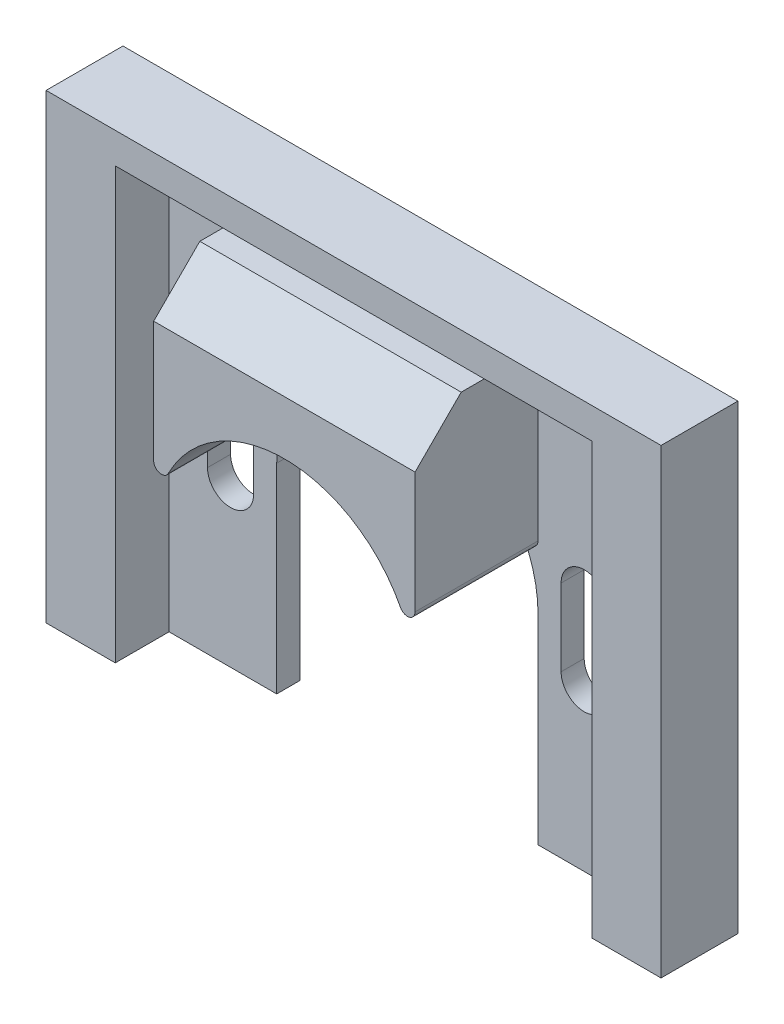
ISO-10303-21;
HEADER;
FILE_DESCRIPTION(('STEP AP214'),'2;1');
FILE_NAME('part.step','',(''),(''),'','','');
FILE_SCHEMA(('AUTOMOTIVE_DESIGN { 1 0 10303 214 1 1 1 1 }'));
ENDSEC;
DATA;
#1=APPLICATION_CONTEXT('core data for automotive mechanical design processes');
#2=APPLICATION_PROTOCOL_DEFINITION('international standard','automotive_design',2000,#1);
#3=PRODUCT_CONTEXT('',#1,'mechanical');
#4=PRODUCT('Part','Part','',(#3));
#5=PRODUCT_RELATED_PRODUCT_CATEGORY('part','',(#4));
#6=PRODUCT_DEFINITION_FORMATION('','',#4);
#7=PRODUCT_DEFINITION_CONTEXT('part definition',#1,'design');
#8=PRODUCT_DEFINITION('design','',#6,#7);
#9=PRODUCT_DEFINITION_SHAPE('','',#8);
#10=(LENGTH_UNIT() NAMED_UNIT(*) SI_UNIT(.MILLI.,.METRE.));
#11=(NAMED_UNIT(*) PLANE_ANGLE_UNIT() SI_UNIT($,.RADIAN.));
#12=(NAMED_UNIT(*) SI_UNIT($,.STERADIAN.) SOLID_ANGLE_UNIT());
#13=UNCERTAINTY_MEASURE_WITH_UNIT(LENGTH_MEASURE(1.E-05),#10,'distance_accuracy_value','');
#14=(GEOMETRIC_REPRESENTATION_CONTEXT(3) GLOBAL_UNCERTAINTY_ASSIGNED_CONTEXT((#13)) GLOBAL_UNIT_ASSIGNED_CONTEXT((#10,
#11,#12)) REPRESENTATION_CONTEXT('',''));
#15=CARTESIAN_POINT('',(0.,0.,0.));
#16=DIRECTION('',(0.,0.,1.));
#17=DIRECTION('',(1.,0.,0.));
#18=AXIS2_PLACEMENT_3D('',#15,#16,#17);
#19=CARTESIAN_POINT('',(-15.5,13.,1.5));
#20=DIRECTION('',(0.,1.,0.));
#21=DIRECTION('',(0.,0.,1.));
#22=AXIS2_PLACEMENT_3D('',#19,#20,#21);
#23=PLANE('',#22);
#24=DIRECTION('',(0.,0.,-1.));
#25=VECTOR('',#24,1.);
#26=CARTESIAN_POINT('',(8.5,13.,9.5));
#27=LINE('',#26,#25);
#28=CARTESIAN_POINT('',(8.5,13.,5.));
#29=VERTEX_POINT('',#28);
#30=CARTESIAN_POINT('',(8.5,13.,1.5));
#31=VERTEX_POINT('',#30);
#32=EDGE_CURVE('E229',#29,#31,#27,.T.);
#33=ORIENTED_EDGE('',*,*,#32,.T.);
#34=DIRECTION('',(-1.,0.,0.));
#35=VECTOR('',#34,1.);
#36=CARTESIAN_POINT('',(-15.5,13.,1.5));
#37=LINE('',#36,#35);
#38=CARTESIAN_POINT('',(15.5,13.,1.5));
#39=VERTEX_POINT('',#38);
#40=EDGE_CURVE('E241',#39,#31,#37,.T.);
#41=ORIENTED_EDGE('',*,*,#40,.F.);
#42=DIRECTION('',(0.,0.,1.));
#43=VECTOR('',#42,1.);
#44=CARTESIAN_POINT('',(15.5,13.,1.5));
#45=LINE('',#44,#43);
#46=CARTESIAN_POINT('',(15.5,13.,5.));
#47=VERTEX_POINT('',#46);
#48=EDGE_CURVE('E273',#39,#47,#45,.T.);
#49=ORIENTED_EDGE('',*,*,#48,.T.);
#50=DIRECTION('',(-1.,0.,0.));
#51=VECTOR('',#50,1.);
#52=CARTESIAN_POINT('',(-15.5,13.,5.));
#53=LINE('',#52,#51);
#54=EDGE_CURVE('E243',#47,#29,#53,.T.);
#55=ORIENTED_EDGE('',*,*,#54,.T.);
#56=EDGE_LOOP('',(#33,#41,#49,#55));
#57=FACE_BOUND('',#56,.T.);
#58=ADVANCED_FACE('F41',(#57),#23,.F.);
#59=DIRECTION('',(0.,0.,-1.));
#60=VECTOR('',#59,1.);
#61=CARTESIAN_POINT('',(-8.5,13.,9.5));
#62=LINE('',#61,#60);
#63=CARTESIAN_POINT('',(-8.5,13.,5.));
#64=VERTEX_POINT('',#63);
#65=CARTESIAN_POINT('',(-8.5,13.,1.5));
#66=VERTEX_POINT('',#65);
#67=EDGE_CURVE('E346',#64,#66,#62,.T.);
#68=ORIENTED_EDGE('',*,*,#67,.F.);
#69=CARTESIAN_POINT('',(-15.5,13.,5.));
#70=VERTEX_POINT('',#69);
#71=EDGE_CURVE('E266',#64,#70,#53,.T.);
#72=ORIENTED_EDGE('',*,*,#71,.T.);
#73=DIRECTION('',(0.,0.,1.));
#74=VECTOR('',#73,1.);
#75=CARTESIAN_POINT('',(-15.5,13.,1.5));
#76=LINE('',#75,#74);
#77=CARTESIAN_POINT('',(-15.5,13.,1.5));
#78=VERTEX_POINT('',#77);
#79=EDGE_CURVE('E269',#78,#70,#76,.T.);
#80=ORIENTED_EDGE('',*,*,#79,.F.);
#81=EDGE_CURVE('E252',#66,#78,#37,.T.);
#82=ORIENTED_EDGE('',*,*,#81,.F.);
#83=EDGE_LOOP('',(#68,#72,#80,#82));
#84=FACE_BOUND('',#83,.T.);
#85=ADVANCED_FACE('F473',(#84),#23,.F.);
#86=CARTESIAN_POINT('',(0.,0.,1.5));
#87=DIRECTION('',(0.,0.,-1.));
#88=DIRECTION('',(-1.,0.,0.));
#89=AXIS2_PLACEMENT_3D('',#86,#87,#88);
#90=PLANE('',#89);
#91=DIRECTION('',(0.,1.,0.));
#92=VECTOR('',#91,1.);
#93=CARTESIAN_POINT('',(13.,-4.5,1.5));
#94=LINE('',#93,#92);
#95=CARTESIAN_POINT('',(13.,-4.5,1.5));
#96=VERTEX_POINT('',#95);
#97=CARTESIAN_POINT('',(13.,0.500000000000004,1.5));
#98=VERTEX_POINT('',#97);
#99=EDGE_CURVE('E376',#96,#98,#94,.T.);
#100=ORIENTED_EDGE('',*,*,#99,.F.);
#101=CARTESIAN_POINT('',(11.5,-4.5,1.5));
#102=DIRECTION('',(0.,0.,1.));
#103=DIRECTION('',(1.,0.,0.));
#104=AXIS2_PLACEMENT_3D('',#101,#102,#103);
#105=CIRCLE('',#104,1.5);
#106=CARTESIAN_POINT('',(10.,-4.5,1.5));
#107=VERTEX_POINT('',#106);
#108=EDGE_CURVE('E379',#107,#96,#105,.T.);
#109=ORIENTED_EDGE('',*,*,#108,.F.);
#110=DIRECTION('',(0.,-1.,0.));
#111=VECTOR('',#110,1.);
#112=CARTESIAN_POINT('',(10.,-4.5,1.5));
#113=LINE('',#112,#111);
#114=CARTESIAN_POINT('',(10.,0.500000000000004,1.5));
#115=VERTEX_POINT('',#114);
#116=EDGE_CURVE('E369',#115,#107,#113,.T.);
#117=ORIENTED_EDGE('',*,*,#116,.F.);
#118=CARTESIAN_POINT('',(11.5,0.500000000000004,1.5));
#119=DIRECTION('',(0.,0.,1.));
#120=DIRECTION('',(-1.,0.,0.));
#121=AXIS2_PLACEMENT_3D('',#118,#119,#120);
#122=CIRCLE('',#121,1.5);
#123=EDGE_CURVE('E372',#98,#115,#122,.T.);
#124=ORIENTED_EDGE('',*,*,#123,.F.);
#125=EDGE_LOOP('',(#100,#109,#117,#124));
#126=FACE_BOUND('',#125,.T.);
#127=DIRECTION('',(0.,1.,0.));
#128=VECTOR('',#127,1.);
#129=CARTESIAN_POINT('',(8.5,13.,1.5));
#130=LINE('',#129,#128);
#131=CARTESIAN_POINT('',(8.5,2.12310562561767,1.5));
#132=VERTEX_POINT('',#131);
#133=EDGE_CURVE('E226',#132,#31,#130,.T.);
#134=ORIENTED_EDGE('',*,*,#133,.F.);
#135=CARTESIAN_POINT('',(8.,2.12310562561767,1.5));
#136=DIRECTION('',(0.,0.,-1.));
#137=DIRECTION('',(-1.,0.,0.));
#138=AXIS2_PLACEMENT_3D('',#135,#136,#137);
#139=CIRCLE('',#138,0.5);
#140=CARTESIAN_POINT('',(7.55555555555556,1.89404420197224,1.5));
#141=VERTEX_POINT('',#140);
#142=EDGE_CURVE('E329',#132,#141,#139,.T.);
#143=ORIENTED_EDGE('',*,*,#142,.T.);
#144=CARTESIAN_POINT('',(0.,-2.,1.5));
#145=DIRECTION('',(0.,0.,-1.));
#146=DIRECTION('',(-1.,0.,0.));
#147=AXIS2_PLACEMENT_3D('',#144,#145,#146);
#148=CIRCLE('',#147,8.5);
#149=CARTESIAN_POINT('',(8.5,-2.,1.5));
#150=VERTEX_POINT('',#149);
#151=EDGE_CURVE('E311',#150,#141,#148,.F.);
#152=ORIENTED_EDGE('',*,*,#151,.F.);
#153=DIRECTION('',(0.,1.,0.));
#154=VECTOR('',#153,1.);
#155=CARTESIAN_POINT('',(8.5,-2.,1.5));
#156=LINE('',#155,#154);
#157=CARTESIAN_POINT('',(8.5,-15.,1.5));
#158=VERTEX_POINT('',#157);
#159=EDGE_CURVE('E426',#158,#150,#156,.T.);
#160=ORIENTED_EDGE('',*,*,#159,.F.);
#161=DIRECTION('',(1.,0.,0.));
#162=VECTOR('',#161,1.);
#163=CARTESIAN_POINT('',(-15.5,-15.,1.5));
#164=LINE('',#163,#162);
#165=CARTESIAN_POINT('',(15.5,-15.,1.5));
#166=VERTEX_POINT('',#165);
#167=EDGE_CURVE('E446',#158,#166,#164,.T.);
#168=ORIENTED_EDGE('',*,*,#167,.T.);
#169=DIRECTION('',(0.,1.,0.));
#170=VECTOR('',#169,1.);
#171=CARTESIAN_POINT('',(15.5,-15.,1.5));
#172=LINE('',#171,#170);
#173=EDGE_CURVE('E250',#166,#39,#172,.T.);
#174=ORIENTED_EDGE('',*,*,#173,.T.);
#175=ORIENTED_EDGE('',*,*,#40,.T.);
#176=EDGE_LOOP('',(#134,#143,#152,#160,#168,#174,#175));
#177=FACE_BOUND('',#176,.T.);
#178=ADVANCED_FACE('F248',(#126,#177),#90,.F.);
#179=DIRECTION('',(0.,1.,0.));
#180=VECTOR('',#179,1.);
#181=CARTESIAN_POINT('',(-10.,-4.5,1.5));
#182=LINE('',#181,#180);
#183=CARTESIAN_POINT('',(-10.,-4.5,1.5));
#184=VERTEX_POINT('',#183);
#185=CARTESIAN_POINT('',(-10.,0.500000000000004,1.5));
#186=VERTEX_POINT('',#185);
#187=EDGE_CURVE('E408',#184,#186,#182,.T.);
#188=ORIENTED_EDGE('',*,*,#187,.F.);
#189=CARTESIAN_POINT('',(-11.5,-4.5,1.5));
#190=DIRECTION('',(0.,0.,1.));
#191=DIRECTION('',(-1.,0.,0.));
#192=AXIS2_PLACEMENT_3D('',#189,#190,#191);
#193=CIRCLE('',#192,1.5);
#194=CARTESIAN_POINT('',(-13.,-4.5,1.5));
#195=VERTEX_POINT('',#194);
#196=EDGE_CURVE('E368',#195,#184,#193,.T.);
#197=ORIENTED_EDGE('',*,*,#196,.F.);
#198=DIRECTION('',(0.,-1.,0.));
#199=VECTOR('',#198,1.);
#200=CARTESIAN_POINT('',(-13.,-4.5,1.5));
#201=LINE('',#200,#199);
#202=CARTESIAN_POINT('',(-13.,0.500000000000004,1.5));
#203=VERTEX_POINT('',#202);
#204=EDGE_CURVE('E401',#203,#195,#201,.T.);
#205=ORIENTED_EDGE('',*,*,#204,.F.);
#206=CARTESIAN_POINT('',(-11.5,0.500000000000004,1.5));
#207=DIRECTION('',(0.,0.,1.));
#208=DIRECTION('',(1.,0.,0.));
#209=AXIS2_PLACEMENT_3D('',#206,#207,#208);
#210=CIRCLE('',#209,1.5);
#211=EDGE_CURVE('E404',#186,#203,#210,.T.);
#212=ORIENTED_EDGE('',*,*,#211,.F.);
#213=EDGE_LOOP('',(#188,#197,#205,#212));
#214=FACE_BOUND('',#213,.T.);
#215=DIRECTION('',(0.,-1.,0.));
#216=VECTOR('',#215,1.);
#217=CARTESIAN_POINT('',(-8.5,-2.00000000000006,1.5));
#218=LINE('',#217,#216);
#219=CARTESIAN_POINT('',(-8.5,2.12310562561767,1.5));
#220=VERTEX_POINT('',#219);
#221=EDGE_CURVE('E236',#66,#220,#218,.T.);
#222=ORIENTED_EDGE('',*,*,#221,.F.);
#223=ORIENTED_EDGE('',*,*,#81,.T.);
#224=DIRECTION('',(0.,-1.,0.));
#225=VECTOR('',#224,1.);
#226=CARTESIAN_POINT('',(-15.5,-15.,1.5));
#227=LINE('',#226,#225);
#228=CARTESIAN_POINT('',(-15.5,-15.,1.5));
#229=VERTEX_POINT('',#228);
#230=EDGE_CURVE('E268',#78,#229,#227,.T.);
#231=ORIENTED_EDGE('',*,*,#230,.T.);
#232=CARTESIAN_POINT('',(-8.5,-15.,1.5));
#233=VERTEX_POINT('',#232);
#234=EDGE_CURVE('E447',#229,#233,#164,.T.);
#235=ORIENTED_EDGE('',*,*,#234,.T.);
#236=DIRECTION('',(0.,-1.,0.));
#237=VECTOR('',#236,1.);
#238=CARTESIAN_POINT('',(-8.5,-15.,1.5));
#239=LINE('',#238,#237);
#240=CARTESIAN_POINT('',(-8.5,-2.,1.5));
#241=VERTEX_POINT('',#240);
#242=EDGE_CURVE('E381',#241,#233,#239,.T.);
#243=ORIENTED_EDGE('',*,*,#242,.F.);
#244=CARTESIAN_POINT('',(0.,-2.,1.5));
#245=DIRECTION('',(0.,0.,-1.));
#246=DIRECTION('',(-1.,0.,0.));
#247=AXIS2_PLACEMENT_3D('',#244,#245,#246);
#248=CIRCLE('',#247,8.5);
#249=CARTESIAN_POINT('',(-7.55555555555556,1.89404420197224,1.5));
#250=VERTEX_POINT('',#249);
#251=EDGE_CURVE('E314',#250,#241,#248,.F.);
#252=ORIENTED_EDGE('',*,*,#251,.F.);
#253=CARTESIAN_POINT('',(-8.,2.12310562561767,1.5));
#254=DIRECTION('',(0.,0.,-1.));
#255=DIRECTION('',(-1.,0.,0.));
#256=AXIS2_PLACEMENT_3D('',#253,#254,#255);
#257=CIRCLE('',#256,0.5);
#258=EDGE_CURVE('E327',#250,#220,#257,.T.);
#259=ORIENTED_EDGE('',*,*,#258,.T.);
#260=EDGE_LOOP('',(#222,#223,#231,#235,#243,#252,#259));
#261=FACE_BOUND('',#260,.T.);
#262=ADVANCED_FACE('F476',(#214,#261),#90,.F.);
#263=CARTESIAN_POINT('',(-20.,-15.,5.));
#264=DIRECTION('',(0.,1.,0.));
#265=DIRECTION('',(0.,0.,1.));
#266=AXIS2_PLACEMENT_3D('',#263,#264,#265);
#267=PLANE('',#266);
#268=ORIENTED_EDGE('',*,*,#167,.F.);
#269=DIRECTION('',(0.,0.,1.));
#270=VECTOR('',#269,1.);
#271=CARTESIAN_POINT('',(8.5,-15.,0.));
#272=LINE('',#271,#270);
#273=CARTESIAN_POINT('',(8.5,-15.,0.));
#274=VERTEX_POINT('',#273);
#275=EDGE_CURVE('E438',#274,#158,#272,.T.);
#276=ORIENTED_EDGE('',*,*,#275,.F.);
#277=DIRECTION('',(1.,0.,0.));
#278=VECTOR('',#277,1.);
#279=CARTESIAN_POINT('',(-20.,-15.,0.));
#280=LINE('',#279,#278);
#281=CARTESIAN_POINT('',(20.,-15.,0.));
#282=VERTEX_POINT('',#281);
#283=EDGE_CURVE('E295',#274,#282,#280,.T.);
#284=ORIENTED_EDGE('',*,*,#283,.T.);
#285=DIRECTION('',(0.,0.,-1.));
#286=VECTOR('',#285,1.);
#287=CARTESIAN_POINT('',(20.,-15.,5.));
#288=LINE('',#287,#286);
#289=CARTESIAN_POINT('',(20.,-15.,5.));
#290=VERTEX_POINT('',#289);
#291=EDGE_CURVE('E288',#290,#282,#288,.T.);
#292=ORIENTED_EDGE('',*,*,#291,.F.);
#293=DIRECTION('',(1.,0.,0.));
#294=VECTOR('',#293,1.);
#295=CARTESIAN_POINT('',(-20.,-15.,5.));
#296=LINE('',#295,#294);
#297=CARTESIAN_POINT('',(15.5,-15.,5.));
#298=VERTEX_POINT('',#297);
#299=EDGE_CURVE('E284',#298,#290,#296,.T.);
#300=ORIENTED_EDGE('',*,*,#299,.F.);
#301=DIRECTION('',(0.,0.,1.));
#302=VECTOR('',#301,1.);
#303=CARTESIAN_POINT('',(15.5,-15.,1.5));
#304=LINE('',#303,#302);
#305=EDGE_CURVE('E255',#166,#298,#304,.T.);
#306=ORIENTED_EDGE('',*,*,#305,.F.);
#307=EDGE_LOOP('',(#268,#276,#284,#292,#300,#306));
#308=FACE_BOUND('',#307,.T.);
#309=ADVANCED_FACE('F461',(#308),#267,.F.);
#310=CARTESIAN_POINT('',(20.,-15.,5.));
#311=DIRECTION('',(-1.,0.,0.));
#312=DIRECTION('',(0.,0.,1.));
#313=AXIS2_PLACEMENT_3D('',#310,#311,#312);
#314=PLANE('',#313);
#315=DIRECTION('',(0.,1.,0.));
#316=VECTOR('',#315,1.);
#317=CARTESIAN_POINT('',(20.,-15.,0.));
#318=LINE('',#317,#316);
#319=CARTESIAN_POINT('',(20.,15.,0.));
#320=VERTEX_POINT('',#319);
#321=EDGE_CURVE('E272',#282,#320,#318,.T.);
#322=ORIENTED_EDGE('',*,*,#321,.T.);
#323=DIRECTION('',(0.,0.,-1.));
#324=VECTOR('',#323,1.);
#325=CARTESIAN_POINT('',(20.,15.,5.));
#326=LINE('',#325,#324);
#327=CARTESIAN_POINT('',(20.,15.,5.));
#328=VERTEX_POINT('',#327);
#329=EDGE_CURVE('E306',#328,#320,#326,.T.);
#330=ORIENTED_EDGE('',*,*,#329,.F.);
#331=DIRECTION('',(0.,1.,0.));
#332=VECTOR('',#331,1.);
#333=CARTESIAN_POINT('',(20.,-15.,5.));
#334=LINE('',#333,#332);
#335=EDGE_CURVE('E276',#290,#328,#334,.T.);
#336=ORIENTED_EDGE('',*,*,#335,.F.);
#337=ORIENTED_EDGE('',*,*,#291,.T.);
#338=EDGE_LOOP('',(#322,#330,#336,#337));
#339=FACE_BOUND('',#338,.T.);
#340=ADVANCED_FACE('F525',(#339),#314,.F.);
#341=CARTESIAN_POINT('',(-20.,15.,5.));
#342=DIRECTION('',(0.,-1.,0.));
#343=DIRECTION('',(0.,0.,-1.));
#344=AXIS2_PLACEMENT_3D('',#341,#342,#343);
#345=PLANE('',#344);
#346=DIRECTION('',(-1.,0.,0.));
#347=VECTOR('',#346,1.);
#348=CARTESIAN_POINT('',(-20.,15.,0.));
#349=LINE('',#348,#347);
#350=CARTESIAN_POINT('',(-20.,15.,0.));
#351=VERTEX_POINT('',#350);
#352=EDGE_CURVE('E291',#320,#351,#349,.T.);
#353=ORIENTED_EDGE('',*,*,#352,.T.);
#354=DIRECTION('',(0.,0.,-1.));
#355=VECTOR('',#354,1.);
#356=CARTESIAN_POINT('',(-20.,15.,5.));
#357=LINE('',#356,#355);
#358=CARTESIAN_POINT('',(-20.,15.,5.));
#359=VERTEX_POINT('',#358);
#360=EDGE_CURVE('E303',#359,#351,#357,.T.);
#361=ORIENTED_EDGE('',*,*,#360,.F.);
#362=DIRECTION('',(-1.,0.,0.));
#363=VECTOR('',#362,1.);
#364=CARTESIAN_POINT('',(-20.,15.,5.));
#365=LINE('',#364,#363);
#366=EDGE_CURVE('E279',#328,#359,#365,.T.);
#367=ORIENTED_EDGE('',*,*,#366,.F.);
#368=ORIENTED_EDGE('',*,*,#329,.T.);
#369=EDGE_LOOP('',(#353,#361,#367,#368));
#370=FACE_BOUND('',#369,.T.);
#371=ADVANCED_FACE('F521',(#370),#345,.F.);
#372=CARTESIAN_POINT('',(-20.,-15.,5.));
#373=DIRECTION('',(1.,0.,0.));
#374=DIRECTION('',(0.,0.,-1.));
#375=AXIS2_PLACEMENT_3D('',#372,#373,#374);
#376=PLANE('',#375);
#377=DIRECTION('',(0.,-1.,0.));
#378=VECTOR('',#377,1.);
#379=CARTESIAN_POINT('',(-20.,-15.,0.));
#380=LINE('',#379,#378);
#381=CARTESIAN_POINT('',(-20.,-15.,0.));
#382=VERTEX_POINT('',#381);
#383=EDGE_CURVE('E293',#351,#382,#380,.T.);
#384=ORIENTED_EDGE('',*,*,#383,.T.);
#385=DIRECTION('',(0.,0.,-1.));
#386=VECTOR('',#385,1.);
#387=CARTESIAN_POINT('',(-20.,-15.,5.));
#388=LINE('',#387,#386);
#389=CARTESIAN_POINT('',(-20.,-15.,5.));
#390=VERTEX_POINT('',#389);
#391=EDGE_CURVE('E300',#390,#382,#388,.T.);
#392=ORIENTED_EDGE('',*,*,#391,.F.);
#393=DIRECTION('',(0.,-1.,0.));
#394=VECTOR('',#393,1.);
#395=CARTESIAN_POINT('',(-20.,-15.,5.));
#396=LINE('',#395,#394);
#397=EDGE_CURVE('E282',#359,#390,#396,.T.);
#398=ORIENTED_EDGE('',*,*,#397,.F.);
#399=ORIENTED_EDGE('',*,*,#360,.T.);
#400=EDGE_LOOP('',(#384,#392,#398,#399));
#401=FACE_BOUND('',#400,.T.);
#402=ADVANCED_FACE('F517',(#401),#376,.F.);
#403=CARTESIAN_POINT('',(-8.5,-15.,0.));
#404=VERTEX_POINT('',#403);
#405=EDGE_CURVE('E280',#382,#404,#280,.T.);
#406=ORIENTED_EDGE('',*,*,#405,.T.);
#407=DIRECTION('',(0.,0.,1.));
#408=VECTOR('',#407,1.);
#409=CARTESIAN_POINT('',(-8.5,-15.,0.));
#410=LINE('',#409,#408);
#411=EDGE_CURVE('E440',#404,#233,#410,.T.);
#412=ORIENTED_EDGE('',*,*,#411,.T.);
#413=ORIENTED_EDGE('',*,*,#234,.F.);
#414=DIRECTION('',(0.,0.,1.));
#415=VECTOR('',#414,1.);
#416=CARTESIAN_POINT('',(-15.5,-15.,1.5));
#417=LINE('',#416,#415);
#418=CARTESIAN_POINT('',(-15.5,-15.,5.));
#419=VERTEX_POINT('',#418);
#420=EDGE_CURVE('E251',#229,#419,#417,.T.);
#421=ORIENTED_EDGE('',*,*,#420,.T.);
#422=EDGE_CURVE('E285',#390,#419,#296,.T.);
#423=ORIENTED_EDGE('',*,*,#422,.F.);
#424=ORIENTED_EDGE('',*,*,#391,.T.);
#425=EDGE_LOOP('',(#406,#412,#413,#421,#423,#424));
#426=FACE_BOUND('',#425,.T.);
#427=ADVANCED_FACE('F511',(#426),#267,.F.);
#428=CARTESIAN_POINT('',(0.,0.,5.));
#429=DIRECTION('',(0.,0.,-1.));
#430=DIRECTION('',(-1.,0.,0.));
#431=AXIS2_PLACEMENT_3D('',#428,#429,#430);
#432=PLANE('',#431);
#433=ORIENTED_EDGE('',*,*,#422,.T.);
#434=DIRECTION('',(0.,-1.,0.));
#435=VECTOR('',#434,1.);
#436=CARTESIAN_POINT('',(-15.5,-15.,5.));
#437=LINE('',#436,#435);
#438=EDGE_CURVE('E260',#70,#419,#437,.T.);
#439=ORIENTED_EDGE('',*,*,#438,.F.);
#440=ORIENTED_EDGE('',*,*,#71,.F.);
#441=DIRECTION('',(-1.,0.,0.));
#442=VECTOR('',#441,1.);
#443=CARTESIAN_POINT('',(0.,13.,5.));
#444=LINE('',#443,#442);
#445=EDGE_CURVE('E354',#29,#64,#444,.T.);
#446=ORIENTED_EDGE('',*,*,#445,.F.);
#447=ORIENTED_EDGE('',*,*,#54,.F.);
#448=DIRECTION('',(0.,1.,0.));
#449=VECTOR('',#448,1.);
#450=CARTESIAN_POINT('',(15.5,-15.,5.));
#451=LINE('',#450,#449);
#452=EDGE_CURVE('E262',#298,#47,#451,.T.);
#453=ORIENTED_EDGE('',*,*,#452,.F.);
#454=ORIENTED_EDGE('',*,*,#299,.T.);
#455=ORIENTED_EDGE('',*,*,#335,.T.);
#456=ORIENTED_EDGE('',*,*,#366,.T.);
#457=ORIENTED_EDGE('',*,*,#397,.T.);
#458=EDGE_LOOP('',(#433,#439,#440,#446,#447,#453,#454,#455,#456,#457));
#459=FACE_BOUND('',#458,.T.);
#460=ADVANCED_FACE('F465',(#459),#432,.F.);
#461=CARTESIAN_POINT('',(0.,0.,0.));
#462=DIRECTION('',(0.,0.,-1.));
#463=DIRECTION('',(-1.,0.,0.));
#464=AXIS2_PLACEMENT_3D('',#461,#462,#463);
#465=PLANE('',#464);
#466=CARTESIAN_POINT('',(-11.5,-4.5,0.));
#467=DIRECTION('',(0.,0.,1.));
#468=DIRECTION('',(-1.,0.,0.));
#469=AXIS2_PLACEMENT_3D('',#466,#467,#468);
#470=CIRCLE('',#469,1.5);
#471=CARTESIAN_POINT('',(-13.,-4.5,0.));
#472=VERTEX_POINT('',#471);
#473=CARTESIAN_POINT('',(-10.,-4.5,0.));
#474=VERTEX_POINT('',#473);
#475=EDGE_CURVE('E405',#472,#474,#470,.T.);
#476=ORIENTED_EDGE('',*,*,#475,.T.);
#477=DIRECTION('',(0.,1.,0.));
#478=VECTOR('',#477,1.);
#479=CARTESIAN_POINT('',(-10.,-4.5,0.));
#480=LINE('',#479,#478);
#481=CARTESIAN_POINT('',(-10.,0.500000000000004,0.));
#482=VERTEX_POINT('',#481);
#483=EDGE_CURVE('E417',#474,#482,#480,.T.);
#484=ORIENTED_EDGE('',*,*,#483,.T.);
#485=CARTESIAN_POINT('',(-11.5,0.500000000000004,0.));
#486=DIRECTION('',(0.,0.,1.));
#487=DIRECTION('',(1.,0.,0.));
#488=AXIS2_PLACEMENT_3D('',#485,#486,#487);
#489=CIRCLE('',#488,1.5);
#490=CARTESIAN_POINT('',(-13.,0.500000000000004,0.));
#491=VERTEX_POINT('',#490);
#492=EDGE_CURVE('E414',#482,#491,#489,.T.);
#493=ORIENTED_EDGE('',*,*,#492,.T.);
#494=DIRECTION('',(0.,-1.,0.));
#495=VECTOR('',#494,1.);
#496=CARTESIAN_POINT('',(-13.,-4.5,0.));
#497=LINE('',#496,#495);
#498=EDGE_CURVE('E395',#491,#472,#497,.T.);
#499=ORIENTED_EDGE('',*,*,#498,.T.);
#500=EDGE_LOOP('',(#476,#484,#493,#499));
#501=FACE_BOUND('',#500,.T.);
#502=CARTESIAN_POINT('',(11.5,-4.5,0.));
#503=DIRECTION('',(0.,0.,1.));
#504=DIRECTION('',(1.,0.,0.));
#505=AXIS2_PLACEMENT_3D('',#502,#503,#504);
#506=CIRCLE('',#505,1.5);
#507=CARTESIAN_POINT('',(10.,-4.5,0.));
#508=VERTEX_POINT('',#507);
#509=CARTESIAN_POINT('',(13.,-4.5,0.));
#510=VERTEX_POINT('',#509);
#511=EDGE_CURVE('E373',#508,#510,#506,.T.);
#512=ORIENTED_EDGE('',*,*,#511,.T.);
#513=DIRECTION('',(0.,1.,0.));
#514=VECTOR('',#513,1.);
#515=CARTESIAN_POINT('',(13.,-4.5,0.));
#516=LINE('',#515,#514);
#517=CARTESIAN_POINT('',(13.,0.500000000000004,0.));
#518=VERTEX_POINT('',#517);
#519=EDGE_CURVE('E387',#510,#518,#516,.T.);
#520=ORIENTED_EDGE('',*,*,#519,.T.);
#521=CARTESIAN_POINT('',(11.5,0.500000000000004,0.));
#522=DIRECTION('',(0.,0.,1.));
#523=DIRECTION('',(-1.,0.,0.));
#524=AXIS2_PLACEMENT_3D('',#521,#522,#523);
#525=CIRCLE('',#524,1.5);
#526=CARTESIAN_POINT('',(10.,0.500000000000004,0.));
#527=VERTEX_POINT('',#526);
#528=EDGE_CURVE('E384',#518,#527,#525,.T.);
#529=ORIENTED_EDGE('',*,*,#528,.T.);
#530=DIRECTION('',(0.,-1.,0.));
#531=VECTOR('',#530,1.);
#532=CARTESIAN_POINT('',(10.,-4.5,0.));
#533=LINE('',#532,#531);
#534=EDGE_CURVE('E361',#527,#508,#533,.T.);
#535=ORIENTED_EDGE('',*,*,#534,.T.);
#536=EDGE_LOOP('',(#512,#520,#529,#535));
#537=FACE_BOUND('',#536,.T.);
#538=DIRECTION('',(0.,1.,0.));
#539=VECTOR('',#538,1.);
#540=CARTESIAN_POINT('',(8.5,-2.,0.));
#541=LINE('',#540,#539);
#542=CARTESIAN_POINT('',(8.5,-2.,0.));
#543=VERTEX_POINT('',#542);
#544=EDGE_CURVE('E429',#274,#543,#541,.T.);
#545=ORIENTED_EDGE('',*,*,#544,.T.);
#546=CARTESIAN_POINT('',(0.,-2.,0.));
#547=DIRECTION('',(0.,0.,1.));
#548=DIRECTION('',(1.,0.,0.));
#549=AXIS2_PLACEMENT_3D('',#546,#547,#548);
#550=CIRCLE('',#549,8.5);
#551=CARTESIAN_POINT('',(-8.5,-2.,0.));
#552=VERTEX_POINT('',#551);
#553=EDGE_CURVE('E422',#543,#552,#550,.T.);
#554=ORIENTED_EDGE('',*,*,#553,.T.);
#555=DIRECTION('',(0.,-1.,0.));
#556=VECTOR('',#555,1.);
#557=CARTESIAN_POINT('',(-8.5,-15.,0.));
#558=LINE('',#557,#556);
#559=EDGE_CURVE('E425',#552,#404,#558,.T.);
#560=ORIENTED_EDGE('',*,*,#559,.T.);
#561=ORIENTED_EDGE('',*,*,#405,.F.);
#562=ORIENTED_EDGE('',*,*,#383,.F.);
#563=ORIENTED_EDGE('',*,*,#352,.F.);
#564=ORIENTED_EDGE('',*,*,#321,.F.);
#565=ORIENTED_EDGE('',*,*,#283,.F.);
#566=EDGE_LOOP('',(#545,#554,#560,#561,#562,#563,#564,#565));
#567=FACE_BOUND('',#566,.T.);
#568=ADVANCED_FACE('F507',(#501,#537,#567),#465,.T.);
#569=CARTESIAN_POINT('',(-15.5,-15.,1.5));
#570=DIRECTION('',(-1.,0.,0.));
#571=DIRECTION('',(0.,0.,1.));
#572=AXIS2_PLACEMENT_3D('',#569,#570,#571);
#573=PLANE('',#572);
#574=ORIENTED_EDGE('',*,*,#438,.T.);
#575=ORIENTED_EDGE('',*,*,#420,.F.);
#576=ORIENTED_EDGE('',*,*,#230,.F.);
#577=ORIENTED_EDGE('',*,*,#79,.T.);
#578=EDGE_LOOP('',(#574,#575,#576,#577));
#579=FACE_BOUND('',#578,.T.);
#580=ADVANCED_FACE('F504',(#579),#573,.F.);
#581=CARTESIAN_POINT('',(15.5,-15.,1.5));
#582=DIRECTION('',(1.,0.,0.));
#583=DIRECTION('',(0.,1.,0.));
#584=AXIS2_PLACEMENT_3D('',#581,#582,#583);
#585=PLANE('',#584);
#586=ORIENTED_EDGE('',*,*,#452,.T.);
#587=ORIENTED_EDGE('',*,*,#48,.F.);
#588=ORIENTED_EDGE('',*,*,#173,.F.);
#589=ORIENTED_EDGE('',*,*,#305,.T.);
#590=EDGE_LOOP('',(#586,#587,#588,#589));
#591=FACE_BOUND('',#590,.T.);
#592=ADVANCED_FACE('F458',(#591),#585,.F.);
#593=CARTESIAN_POINT('',(0.,-2.,0.));
#594=DIRECTION('',(0.,0.,1.));
#595=DIRECTION('',(1.,0.,0.));
#596=AXIS2_PLACEMENT_3D('',#593,#594,#595);
#597=CYLINDRICAL_SURFACE('',#596,8.5);
#598=CARTESIAN_POINT('',(0.,-2.00000000000003,9.5));
#599=DIRECTION('',(0.,0.,-1.));
#600=DIRECTION('',(-1.,0.,0.));
#601=AXIS2_PLACEMENT_3D('',#598,#599,#600);
#602=CIRCLE('',#601,8.5);
#603=CARTESIAN_POINT('',(-7.55555555555554,1.89404420197223,9.5));
#604=VERTEX_POINT('',#603);
#605=CARTESIAN_POINT('',(7.55555555555554,1.89404420197223,9.5));
#606=VERTEX_POINT('',#605);
#607=EDGE_CURVE('E349',#604,#606,#602,.T.);
#608=ORIENTED_EDGE('',*,*,#607,.F.);
#609=DIRECTION('',(0.,0.,1.));
#610=VECTOR('',#609,1.);
#611=CARTESIAN_POINT('',(-7.55555555555556,1.89404420197224,0.));
#612=LINE('',#611,#610);
#613=EDGE_CURVE('E316',#604,#250,#612,.F.);
#614=ORIENTED_EDGE('',*,*,#613,.T.);
#615=ORIENTED_EDGE('',*,*,#251,.T.);
#616=DIRECTION('',(0.,0.,1.));
#617=VECTOR('',#616,1.);
#618=CARTESIAN_POINT('',(-8.5,-2.,0.));
#619=LINE('',#618,#617);
#620=EDGE_CURVE('E432',#552,#241,#619,.T.);
#621=ORIENTED_EDGE('',*,*,#620,.F.);
#622=ORIENTED_EDGE('',*,*,#553,.F.);
#623=DIRECTION('',(0.,0.,1.));
#624=VECTOR('',#623,1.);
#625=CARTESIAN_POINT('',(8.5,-2.,0.));
#626=LINE('',#625,#624);
#627=EDGE_CURVE('E263',#543,#150,#626,.T.);
#628=ORIENTED_EDGE('',*,*,#627,.T.);
#629=ORIENTED_EDGE('',*,*,#151,.T.);
#630=DIRECTION('',(0.,0.,1.));
#631=VECTOR('',#630,1.);
#632=CARTESIAN_POINT('',(7.55555555555556,1.89404420197224,0.));
#633=LINE('',#632,#631);
#634=EDGE_CURVE('E309',#141,#606,#633,.T.);
#635=ORIENTED_EDGE('',*,*,#634,.T.);
#636=EDGE_LOOP('',(#608,#614,#615,#621,#622,#628,#629,#635));
#637=FACE_BOUND('',#636,.T.);
#638=ADVANCED_FACE('F485',(#637),#597,.F.);
#639=CARTESIAN_POINT('',(8.5,-2.,0.));
#640=DIRECTION('',(1.,0.,0.));
#641=DIRECTION('',(0.,0.,-1.));
#642=AXIS2_PLACEMENT_3D('',#639,#640,#641);
#643=PLANE('',#642);
#644=ORIENTED_EDGE('',*,*,#159,.T.);
#645=ORIENTED_EDGE('',*,*,#627,.F.);
#646=ORIENTED_EDGE('',*,*,#544,.F.);
#647=ORIENTED_EDGE('',*,*,#275,.T.);
#648=EDGE_LOOP('',(#644,#645,#646,#647));
#649=FACE_BOUND('',#648,.T.);
#650=ADVANCED_FACE('F577',(#649),#643,.F.);
#651=CARTESIAN_POINT('',(-8.5,-15.,0.));
#652=DIRECTION('',(-1.,0.,0.));
#653=DIRECTION('',(0.,0.,1.));
#654=AXIS2_PLACEMENT_3D('',#651,#652,#653);
#655=PLANE('',#654);
#656=ORIENTED_EDGE('',*,*,#242,.T.);
#657=ORIENTED_EDGE('',*,*,#411,.F.);
#658=ORIENTED_EDGE('',*,*,#559,.F.);
#659=ORIENTED_EDGE('',*,*,#620,.T.);
#660=EDGE_LOOP('',(#656,#657,#658,#659));
#661=FACE_BOUND('',#660,.T.);
#662=ADVANCED_FACE('F549',(#661),#655,.F.);
#663=CARTESIAN_POINT('',(11.5,-4.5,0.));
#664=DIRECTION('',(0.,0.,1.));
#665=DIRECTION('',(1.,0.,0.));
#666=AXIS2_PLACEMENT_3D('',#663,#664,#665);
#667=CYLINDRICAL_SURFACE('',#666,1.5);
#668=ORIENTED_EDGE('',*,*,#108,.T.);
#669=DIRECTION('',(0.,0.,1.));
#670=VECTOR('',#669,1.);
#671=CARTESIAN_POINT('',(13.,-4.5,0.));
#672=LINE('',#671,#670);
#673=EDGE_CURVE('E358',#510,#96,#672,.T.);
#674=ORIENTED_EDGE('',*,*,#673,.F.);
#675=ORIENTED_EDGE('',*,*,#511,.F.);
#676=DIRECTION('',(0.,0.,1.));
#677=VECTOR('',#676,1.);
#678=CARTESIAN_POINT('',(10.,-4.5,0.));
#679=LINE('',#678,#677);
#680=EDGE_CURVE('E366',#508,#107,#679,.T.);
#681=ORIENTED_EDGE('',*,*,#680,.T.);
#682=EDGE_LOOP('',(#668,#674,#675,#681));
#683=FACE_BOUND('',#682,.T.);
#684=ADVANCED_FACE('F545',(#683),#667,.F.);
#685=CARTESIAN_POINT('',(10.,-4.5,0.));
#686=DIRECTION('',(-1.,0.,0.));
#687=DIRECTION('',(0.,0.,1.));
#688=AXIS2_PLACEMENT_3D('',#685,#686,#687);
#689=PLANE('',#688);
#690=ORIENTED_EDGE('',*,*,#116,.T.);
#691=ORIENTED_EDGE('',*,*,#680,.F.);
#692=ORIENTED_EDGE('',*,*,#534,.F.);
#693=DIRECTION('',(0.,0.,1.));
#694=VECTOR('',#693,1.);
#695=CARTESIAN_POINT('',(10.,0.500000000000004,0.));
#696=LINE('',#695,#694);
#697=EDGE_CURVE('E364',#527,#115,#696,.T.);
#698=ORIENTED_EDGE('',*,*,#697,.T.);
#699=EDGE_LOOP('',(#690,#691,#692,#698));
#700=FACE_BOUND('',#699,.T.);
#701=ADVANCED_FACE('F548',(#700),#689,.F.);
#702=CARTESIAN_POINT('',(11.5,0.500000000000004,0.));
#703=DIRECTION('',(0.,0.,1.));
#704=DIRECTION('',(1.,0.,0.));
#705=AXIS2_PLACEMENT_3D('',#702,#703,#704);
#706=CYLINDRICAL_SURFACE('',#705,1.5);
#707=ORIENTED_EDGE('',*,*,#123,.T.);
#708=ORIENTED_EDGE('',*,*,#697,.F.);
#709=ORIENTED_EDGE('',*,*,#528,.F.);
#710=DIRECTION('',(0.,0.,1.));
#711=VECTOR('',#710,1.);
#712=CARTESIAN_POINT('',(13.,0.500000000000004,0.));
#713=LINE('',#712,#711);
#714=EDGE_CURVE('E362',#518,#98,#713,.T.);
#715=ORIENTED_EDGE('',*,*,#714,.T.);
#716=EDGE_LOOP('',(#707,#708,#709,#715));
#717=FACE_BOUND('',#716,.T.);
#718=ADVANCED_FACE('F555',(#717),#706,.F.);
#719=CARTESIAN_POINT('',(13.,-4.5,0.));
#720=DIRECTION('',(1.,0.,0.));
#721=DIRECTION('',(0.,0.,-1.));
#722=AXIS2_PLACEMENT_3D('',#719,#720,#721);
#723=PLANE('',#722);
#724=ORIENTED_EDGE('',*,*,#99,.T.);
#725=ORIENTED_EDGE('',*,*,#714,.F.);
#726=ORIENTED_EDGE('',*,*,#519,.F.);
#727=ORIENTED_EDGE('',*,*,#673,.T.);
#728=EDGE_LOOP('',(#724,#725,#726,#727));
#729=FACE_BOUND('',#728,.T.);
#730=ADVANCED_FACE('F551',(#729),#723,.F.);
#731=CARTESIAN_POINT('',(-11.5,-4.5,0.));
#732=DIRECTION('',(0.,0.,1.));
#733=DIRECTION('',(1.,0.,0.));
#734=AXIS2_PLACEMENT_3D('',#731,#732,#733);
#735=CYLINDRICAL_SURFACE('',#734,1.5);
#736=ORIENTED_EDGE('',*,*,#196,.T.);
#737=DIRECTION('',(0.,0.,1.));
#738=VECTOR('',#737,1.);
#739=CARTESIAN_POINT('',(-10.,-4.5,0.));
#740=LINE('',#739,#738);
#741=EDGE_CURVE('E392',#474,#184,#740,.T.);
#742=ORIENTED_EDGE('',*,*,#741,.F.);
#743=ORIENTED_EDGE('',*,*,#475,.F.);
#744=DIRECTION('',(0.,0.,1.));
#745=VECTOR('',#744,1.);
#746=CARTESIAN_POINT('',(-13.,-4.5,0.));
#747=LINE('',#746,#745);
#748=EDGE_CURVE('E357',#472,#195,#747,.T.);
#749=ORIENTED_EDGE('',*,*,#748,.T.);
#750=EDGE_LOOP('',(#736,#742,#743,#749));
#751=FACE_BOUND('',#750,.T.);
#752=ADVANCED_FACE('F554',(#751),#735,.F.);
#753=CARTESIAN_POINT('',(-13.,-4.5,0.));
#754=DIRECTION('',(-1.,0.,0.));
#755=DIRECTION('',(0.,0.,1.));
#756=AXIS2_PLACEMENT_3D('',#753,#754,#755);
#757=PLANE('',#756);
#758=ORIENTED_EDGE('',*,*,#204,.T.);
#759=ORIENTED_EDGE('',*,*,#748,.F.);
#760=ORIENTED_EDGE('',*,*,#498,.F.);
#761=DIRECTION('',(0.,0.,1.));
#762=VECTOR('',#761,1.);
#763=CARTESIAN_POINT('',(-13.,0.500000000000004,0.));
#764=LINE('',#763,#762);
#765=EDGE_CURVE('E398',#491,#203,#764,.T.);
#766=ORIENTED_EDGE('',*,*,#765,.T.);
#767=EDGE_LOOP('',(#758,#759,#760,#766));
#768=FACE_BOUND('',#767,.T.);
#769=ADVANCED_FACE('F565',(#768),#757,.F.);
#770=CARTESIAN_POINT('',(-11.5,0.500000000000004,0.));
#771=DIRECTION('',(0.,0.,1.));
#772=DIRECTION('',(1.,0.,0.));
#773=AXIS2_PLACEMENT_3D('',#770,#771,#772);
#774=CYLINDRICAL_SURFACE('',#773,1.5);
#775=ORIENTED_EDGE('',*,*,#211,.T.);
#776=ORIENTED_EDGE('',*,*,#765,.F.);
#777=ORIENTED_EDGE('',*,*,#492,.F.);
#778=DIRECTION('',(0.,0.,1.));
#779=VECTOR('',#778,1.);
#780=CARTESIAN_POINT('',(-10.,0.500000000000004,0.));
#781=LINE('',#780,#779);
#782=EDGE_CURVE('E396',#482,#186,#781,.T.);
#783=ORIENTED_EDGE('',*,*,#782,.T.);
#784=EDGE_LOOP('',(#775,#776,#777,#783));
#785=FACE_BOUND('',#784,.T.);
#786=ADVANCED_FACE('F569',(#785),#774,.F.);
#787=CARTESIAN_POINT('',(-10.,-4.5,0.));
#788=DIRECTION('',(1.,0.,0.));
#789=DIRECTION('',(0.,0.,-1.));
#790=AXIS2_PLACEMENT_3D('',#787,#788,#789);
#791=PLANE('',#790);
#792=ORIENTED_EDGE('',*,*,#187,.T.);
#793=ORIENTED_EDGE('',*,*,#782,.F.);
#794=ORIENTED_EDGE('',*,*,#483,.F.);
#795=ORIENTED_EDGE('',*,*,#741,.T.);
#796=EDGE_LOOP('',(#792,#793,#794,#795));
#797=FACE_BOUND('',#796,.T.);
#798=ADVANCED_FACE('F542',(#797),#791,.F.);
#799=CARTESIAN_POINT('',(-8.5,13.,9.5));
#800=DIRECTION('',(0.,-1.,0.));
#801=DIRECTION('',(0.,0.,-1.));
#802=AXIS2_PLACEMENT_3D('',#799,#800,#801);
#803=PLANE('',#802);
#804=CARTESIAN_POINT('',(-8.5,13.,6.49999999999999));
#805=VERTEX_POINT('',#804);
#806=EDGE_CURVE('E245',#805,#64,#62,.T.);
#807=ORIENTED_EDGE('',*,*,#806,.F.);
#808=DIRECTION('',(1.,0.,0.));
#809=VECTOR('',#808,1.);
#810=CARTESIAN_POINT('',(-8.5,13.,6.49999999999999));
#811=LINE('',#810,#809);
#812=CARTESIAN_POINT('',(8.5,13.,6.49999999999999));
#813=VERTEX_POINT('',#812);
#814=EDGE_CURVE('E50',#805,#813,#811,.T.);
#815=ORIENTED_EDGE('',*,*,#814,.T.);
#816=EDGE_CURVE('E244',#813,#29,#27,.T.);
#817=ORIENTED_EDGE('',*,*,#816,.T.);
#818=ORIENTED_EDGE('',*,*,#445,.T.);
#819=EDGE_LOOP('',(#807,#815,#817,#818));
#820=FACE_BOUND('',#819,.T.);
#821=ADVANCED_FACE('F470',(#820),#803,.F.);
#822=CARTESIAN_POINT('',(8.5,13.,9.5));
#823=DIRECTION('',(-1.,0.,0.));
#824=DIRECTION('',(0.,0.,1.));
#825=AXIS2_PLACEMENT_3D('',#822,#823,#824);
#826=PLANE('',#825);
#827=ORIENTED_EDGE('',*,*,#816,.F.);
#828=DIRECTION('',(0.,0.707106781186546,-0.707106781186549));
#829=VECTOR('',#828,1.);
#830=CARTESIAN_POINT('',(8.5,10.,9.5));
#831=LINE('',#830,#829);
#832=CARTESIAN_POINT('',(8.5,10.,9.5));
#833=VERTEX_POINT('',#832);
#834=EDGE_CURVE('E11',#813,#833,#831,.F.);
#835=ORIENTED_EDGE('',*,*,#834,.T.);
#836=DIRECTION('',(0.,1.,0.));
#837=VECTOR('',#836,1.);
#838=CARTESIAN_POINT('',(8.5,13.,9.5));
#839=LINE('',#838,#837);
#840=CARTESIAN_POINT('',(8.5,2.12310562561767,9.5));
#841=VERTEX_POINT('',#840);
#842=EDGE_CURVE('E339',#841,#833,#839,.T.);
#843=ORIENTED_EDGE('',*,*,#842,.F.);
#844=DIRECTION('',(0.,0.,1.));
#845=VECTOR('',#844,1.);
#846=CARTESIAN_POINT('',(8.5,2.12310562561767,9.5));
#847=LINE('',#846,#845);
#848=EDGE_CURVE('E233',#841,#132,#847,.F.);
#849=ORIENTED_EDGE('',*,*,#848,.T.);
#850=ORIENTED_EDGE('',*,*,#133,.T.);
#851=ORIENTED_EDGE('',*,*,#32,.F.);
#852=EDGE_LOOP('',(#827,#835,#843,#849,#850,#851));
#853=FACE_BOUND('',#852,.T.);
#854=ADVANCED_FACE('F228',(#853),#826,.F.);
#855=CARTESIAN_POINT('',(-8.5,-2.00000000000006,9.5));
#856=DIRECTION('',(1.,0.,0.));
#857=DIRECTION('',(0.,0.,-1.));
#858=AXIS2_PLACEMENT_3D('',#855,#856,#857);
#859=PLANE('',#858);
#860=DIRECTION('',(0.,-1.,0.));
#861=VECTOR('',#860,1.);
#862=CARTESIAN_POINT('',(-8.5,-2.00000000000006,9.5));
#863=LINE('',#862,#861);
#864=CARTESIAN_POINT('',(-8.5,10.,9.5));
#865=VERTEX_POINT('',#864);
#866=CARTESIAN_POINT('',(-8.5,2.12310562561767,9.5));
#867=VERTEX_POINT('',#866);
#868=EDGE_CURVE('E338',#865,#867,#863,.T.);
#869=ORIENTED_EDGE('',*,*,#868,.F.);
#870=DIRECTION('',(0.,-0.707106781186546,0.707106781186549));
#871=VECTOR('',#870,1.);
#872=CARTESIAN_POINT('',(-8.5,10.,9.5));
#873=LINE('',#872,#871);
#874=EDGE_CURVE('E64',#865,#805,#873,.F.);
#875=ORIENTED_EDGE('',*,*,#874,.T.);
#876=ORIENTED_EDGE('',*,*,#806,.T.);
#877=ORIENTED_EDGE('',*,*,#67,.T.);
#878=ORIENTED_EDGE('',*,*,#221,.T.);
#879=DIRECTION('',(0.,0.,1.));
#880=VECTOR('',#879,1.);
#881=CARTESIAN_POINT('',(-8.5,2.12310562561767,9.5));
#882=LINE('',#881,#880);
#883=EDGE_CURVE('E319',#220,#867,#882,.T.);
#884=ORIENTED_EDGE('',*,*,#883,.T.);
#885=EDGE_LOOP('',(#869,#875,#876,#877,#878,#884));
#886=FACE_BOUND('',#885,.T.);
#887=ADVANCED_FACE('F342',(#886),#859,.F.);
#888=CARTESIAN_POINT('',(0.,-2.00000000000003,9.5));
#889=DIRECTION('',(0.,0.,-1.));
#890=DIRECTION('',(-1.,0.,0.));
#891=AXIS2_PLACEMENT_3D('',#888,#889,#890);
#892=PLANE('',#891);
#893=ORIENTED_EDGE('',*,*,#842,.T.);
#894=DIRECTION('',(-1.,0.,0.));
#895=VECTOR('',#894,1.);
#896=CARTESIAN_POINT('',(0.,10.,9.5));
#897=LINE('',#896,#895);
#898=EDGE_CURVE('E331',#833,#865,#897,.T.);
#899=ORIENTED_EDGE('',*,*,#898,.T.);
#900=ORIENTED_EDGE('',*,*,#868,.T.);
#901=CARTESIAN_POINT('',(-8.,2.12310562561767,9.5));
#902=DIRECTION('',(0.,0.,-1.));
#903=DIRECTION('',(-1.,0.,0.));
#904=AXIS2_PLACEMENT_3D('',#901,#902,#903);
#905=CIRCLE('',#904,0.5);
#906=EDGE_CURVE('E324',#867,#604,#905,.F.);
#907=ORIENTED_EDGE('',*,*,#906,.T.);
#908=ORIENTED_EDGE('',*,*,#607,.T.);
#909=CARTESIAN_POINT('',(8.,2.12310562561767,9.5));
#910=DIRECTION('',(0.,0.,-1.));
#911=DIRECTION('',(-1.,0.,0.));
#912=AXIS2_PLACEMENT_3D('',#909,#910,#911);
#913=CIRCLE('',#912,0.5);
#914=EDGE_CURVE('E322',#606,#841,#913,.F.);
#915=ORIENTED_EDGE('',*,*,#914,.T.);
#916=EDGE_LOOP('',(#893,#899,#900,#907,#908,#915));
#917=FACE_BOUND('',#916,.T.);
#918=ADVANCED_FACE('F337',(#917),#892,.F.);
#919=CARTESIAN_POINT('',(-8.,2.12310562561767,0.));
#920=DIRECTION('',(0.,0.,1.));
#921=DIRECTION('',(1.,0.,0.));
#922=AXIS2_PLACEMENT_3D('',#919,#920,#921);
#923=CYLINDRICAL_SURFACE('',#922,0.5);
#924=ORIENTED_EDGE('',*,*,#906,.F.);
#925=ORIENTED_EDGE('',*,*,#883,.F.);
#926=ORIENTED_EDGE('',*,*,#258,.F.);
#927=ORIENTED_EDGE('',*,*,#613,.F.);
#928=EDGE_LOOP('',(#924,#925,#926,#927));
#929=FACE_BOUND('',#928,.T.);
#930=ADVANCED_FACE('F480',(#929),#923,.T.);
#931=CARTESIAN_POINT('',(8.,2.12310562561767,0.));
#932=DIRECTION('',(0.,0.,1.));
#933=DIRECTION('',(1.,0.,0.));
#934=AXIS2_PLACEMENT_3D('',#931,#932,#933);
#935=CYLINDRICAL_SURFACE('',#934,0.5);
#936=ORIENTED_EDGE('',*,*,#914,.F.);
#937=ORIENTED_EDGE('',*,*,#634,.F.);
#938=ORIENTED_EDGE('',*,*,#142,.F.);
#939=ORIENTED_EDGE('',*,*,#848,.F.);
#940=EDGE_LOOP('',(#936,#937,#938,#939));
#941=FACE_BOUND('',#940,.T.);
#942=ADVANCED_FACE('F488',(#941),#935,.T.);
#943=CARTESIAN_POINT('',(0.,10.,9.5));
#944=DIRECTION('',(0.,-0.707106781186549,-0.707106781186546));
#945=DIRECTION('',(-1.,0.,0.));
#946=AXIS2_PLACEMENT_3D('',#943,#944,#945);
#947=PLANE('',#946);
#948=ORIENTED_EDGE('',*,*,#834,.F.);
#949=ORIENTED_EDGE('',*,*,#814,.F.);
#950=ORIENTED_EDGE('',*,*,#874,.F.);
#951=ORIENTED_EDGE('',*,*,#898,.F.);
#952=EDGE_LOOP('',(#948,#949,#950,#951));
#953=FACE_BOUND('',#952,.T.);
#954=ADVANCED_FACE('F44',(#953),#947,.F.);
#955=CLOSED_SHELL('',(#58,#85,#178,#262,#309,#340,#371,#402,#427,#460,#568,#580,#592,#638,#650,
#662,#684,#701,#718,#730,#752,#769,#786,#798,#821,#854,#887,#918,#930,#942,#954));
#956=MANIFOLD_SOLID_BREP('B2',#955);
#957=ADVANCED_BREP_SHAPE_REPRESENTATION('',(#18,#956),#14);
#958=SHAPE_DEFINITION_REPRESENTATION(#9,#957);
ENDSEC;
END-ISO-10303-21;
